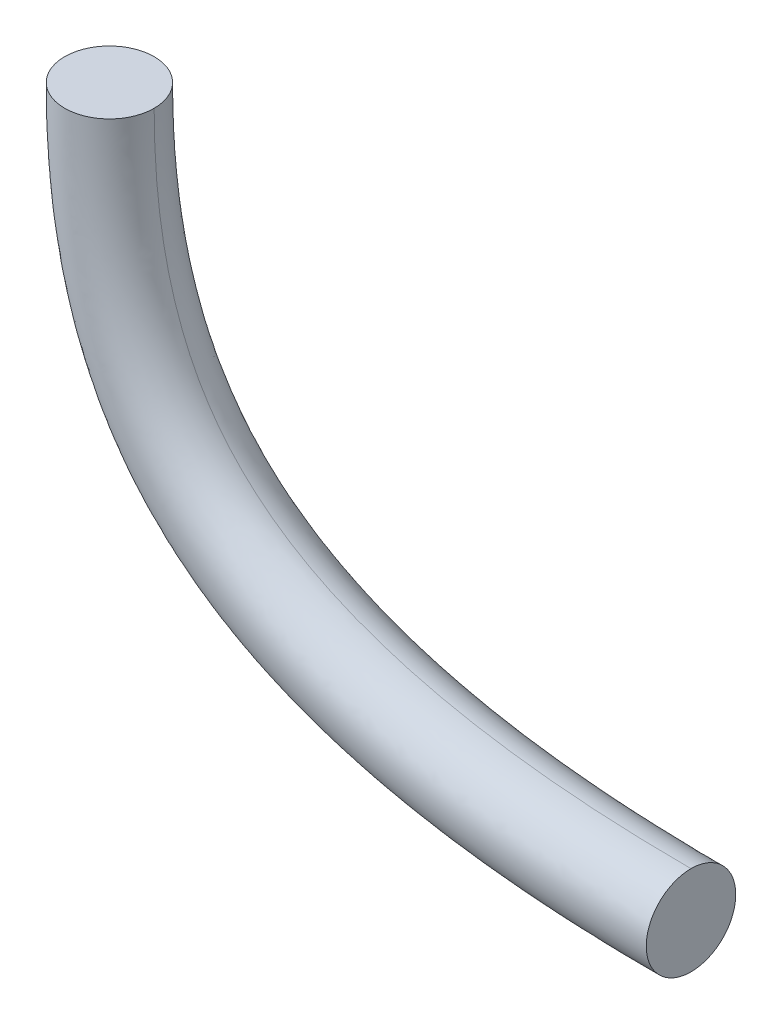
ISO-10303-21;
HEADER;
FILE_DESCRIPTION(('STEP AP214'),'2;1');
FILE_NAME('part.step','',(''),(''),'','','');
FILE_SCHEMA(('AUTOMOTIVE_DESIGN { 1 0 10303 214 1 1 1 1 }'));
ENDSEC;
DATA;
#1=APPLICATION_CONTEXT('core data for automotive mechanical design processes');
#2=APPLICATION_PROTOCOL_DEFINITION('international standard','automotive_design',2000,#1);
#3=PRODUCT_CONTEXT('',#1,'mechanical');
#4=PRODUCT('Part','Part','',(#3));
#5=PRODUCT_RELATED_PRODUCT_CATEGORY('part','',(#4));
#6=PRODUCT_DEFINITION_FORMATION('','',#4);
#7=PRODUCT_DEFINITION_CONTEXT('part definition',#1,'design');
#8=PRODUCT_DEFINITION('design','',#6,#7);
#9=PRODUCT_DEFINITION_SHAPE('','',#8);
#10=(LENGTH_UNIT() NAMED_UNIT(*) SI_UNIT(.MILLI.,.METRE.));
#11=(NAMED_UNIT(*) PLANE_ANGLE_UNIT() SI_UNIT($,.RADIAN.));
#12=(NAMED_UNIT(*) SI_UNIT($,.STERADIAN.) SOLID_ANGLE_UNIT());
#13=UNCERTAINTY_MEASURE_WITH_UNIT(LENGTH_MEASURE(1.E-05),#10,'distance_accuracy_value','');
#14=(GEOMETRIC_REPRESENTATION_CONTEXT(3) GLOBAL_UNCERTAINTY_ASSIGNED_CONTEXT((#13)) GLOBAL_UNIT_ASSIGNED_CONTEXT((#10,
#11,#12)) REPRESENTATION_CONTEXT('',''));
#15=CARTESIAN_POINT('',(0.,0.,0.));
#16=DIRECTION('',(0.,0.,1.));
#17=DIRECTION('',(1.,0.,0.));
#18=AXIS2_PLACEMENT_3D('',#15,#16,#17);
#19=CARTESIAN_POINT('',(-11.,2.,5.5));
#20=DIRECTION('',(1.,0.,0.));
#21=DIRECTION('',(0.,0.,-1.));
#22=AXIS2_PLACEMENT_3D('',#19,#20,#21);
#23=PLANE('',#22);
#24=CARTESIAN_POINT('',(-11.,1.5,5.50000000047467));
#25=CARTESIAN_POINT('',(-11.,1.49997611163594,5.47187159733017));
#26=CARTESIAN_POINT('',(-11.,1.50237219271844,5.4437503249946));
#27=CARTESIAN_POINT('',(-11.,1.51182826652427,5.38832327636678));
#28=CARTESIAN_POINT('',(-11.,1.51888484579792,5.361016918501));
#29=CARTESIAN_POINT('',(-11.,1.53749067930192,5.30796517846619));
#30=CARTESIAN_POINT('',(-11.,1.54904201793691,5.28222052693657));
#31=CARTESIAN_POINT('',(-11.,1.5762990841595,5.23304056135759));
#32=CARTESIAN_POINT('',(-11.,1.59200399558169,5.20960479485917));
#33=CARTESIAN_POINT('',(-11.,1.62711478549402,5.16571566963749));
#34=CARTESIAN_POINT('',(-11.,1.64651841987068,5.14526051570735));
#35=CARTESIAN_POINT('',(-11.,1.68851202082951,5.10786902253602));
#36=CARTESIAN_POINT('',(-11.,1.71110643169979,5.09093767422564));
#37=CARTESIAN_POINT('',(-11.,1.75878176757294,5.06113456911236));
#38=CARTESIAN_POINT('',(-11.,1.78385882090735,5.04825661817199));
#39=CARTESIAN_POINT('',(-11.,1.83586139628351,5.02687188322362));
#40=CARTESIAN_POINT('',(-11.,1.86278993350323,5.01837243040884));
#41=CARTESIAN_POINT('',(-11.,1.91769228379949,5.00601907071486));
#42=CARTESIAN_POINT('',(-11.,1.94566609681218,5.00216516355183));
#43=CARTESIAN_POINT('',(-11.,2.00181651875881,4.99921482539218));
#44=CARTESIAN_POINT('',(-11.,2.02999271217362,5.00011047884485));
#45=CARTESIAN_POINT('',(-11.,2.08583782423317,5.00662053011427));
#46=CARTESIAN_POINT('',(-11.,2.11350591613129,5.01224202345699));
#47=CARTESIAN_POINT('',(-11.,2.16746814800086,5.02804261423192));
#48=CARTESIAN_POINT('',(-11.,2.19376407598446,5.03821560635029));
#49=CARTESIAN_POINT('',(-11.,2.24429409406872,5.06283776563508));
#50=CARTESIAN_POINT('',(-11.,2.26852674010904,5.0772898965418));
#51=CARTESIAN_POINT('',(-11.,2.31422051750209,5.11005665102638));
#52=CARTESIAN_POINT('',(-11.,2.33568178528364,5.12837108435467));
#53=CARTESIAN_POINT('',(-11.,2.37522616019578,5.16834384324538));
#54=CARTESIAN_POINT('',(-11.,2.39330909630998,5.19000233798807));
#55=CARTESIAN_POINT('',(-11.,2.42558091923461,5.23604719162305));
#56=CARTESIAN_POINT('',(-11.,2.43977000834686,5.26043340870594));
#57=CARTESIAN_POINT('',(-11.,2.46386342627468,5.31125990543472));
#58=CARTESIAN_POINT('',(-11.,2.47376434930942,5.33770179816923));
#59=CARTESIAN_POINT('',(-11.,2.48896727952398,5.39183966945039));
#60=CARTESIAN_POINT('',(-11.,2.49427631073339,5.41953366417276));
#61=CARTESIAN_POINT('',(-11.,2.49907939082572,5.46491651856478));
#62=CARTESIAN_POINT('',(-11.,2.50000746944241,5.48246287183833));
#63=CARTESIAN_POINT('',(-11.,2.5,5.5));
#64=B_SPLINE_CURVE_WITH_KNOTS('',3,(#24,#25,#26,#27,#28,#29,#30,#31,#32,#33,#34,#35,#36,#37,#38,
#39,#40,#41,#42,#43,#44,#45,#46,#47,#48,#49,#50,#51,#52,#53,#54,#55,#56,#57,#58,#59,#60,#61,#62,
#63),.UNSPECIFIED.,.F.,.F.,(4,2,2,2,2,2,2,2,2,2,2,2,2,2,2,2,2,2,2,4),(0.,0.0842731266473995,
0.16848459818251,0.252735168669724,0.336969196439848,0.421152278926408,0.505453794405473,
0.589625853237824,0.673938392248186,0.758250926107539,0.842422990094128,0.926721658867329,
1.01090758808817,1.09515196159268,1.17939218635095,1.26363667432551,1.34787678461368,
1.43218367859486,1.51636138252271,1.56897272871681),.UNSPECIFIED.);
#65=CARTESIAN_POINT('',(-11.,1.5,5.50000000047467));
#66=VERTEX_POINT('',#65);
#67=CARTESIAN_POINT('',(-11.,2.5,5.50000000000163));
#68=VERTEX_POINT('',#67);
#69=EDGE_CURVE('E49',#66,#68,#64,.T.);
#70=ORIENTED_EDGE('',*,*,#69,.T.);
#71=CARTESIAN_POINT('',(-11.,2.5,5.50000000000163));
#72=CARTESIAN_POINT('',(-11.,2.50002388833726,5.52812840314616));
#73=CARTESIAN_POINT('',(-11.,2.49762780722797,5.55624967547944));
#74=CARTESIAN_POINT('',(-11.,2.48817173336934,5.61167672409826));
#75=CARTESIAN_POINT('',(-11.,2.48111515406968,5.63898308195731));
#76=CARTESIAN_POINT('',(-11.,2.46250932051515,5.69203482197439));
#77=CARTESIAN_POINT('',(-11.,2.45095798185564,5.71777947349302));
#78=CARTESIAN_POINT('',(-11.,2.4237009155862,5.76695943904602));
#79=CARTESIAN_POINT('',(-11.,2.40799600414168,5.79039520552948));
#80=CARTESIAN_POINT('',(-11.,2.37288521418755,5.83428433071772));
#81=CARTESIAN_POINT('',(-11.,2.3534815797914,5.85473948462938));
#82=CARTESIAN_POINT('',(-11.,2.31148797879695,5.89213097776071));
#83=CARTESIAN_POINT('',(-11.,2.28889356791054,5.90906232604956));
#84=CARTESIAN_POINT('',(-11.,2.241218232009,5.93886543111743));
#85=CARTESIAN_POINT('',(-11.,2.21614117866232,5.9517433820339));
#86=CARTESIAN_POINT('',(-11.,2.16413860326579,5.97312811693273));
#87=CARTESIAN_POINT('',(-11.,2.13721006603798,5.98162756972186));
#88=CARTESIAN_POINT('',(-11.,2.08230771572994,5.99398092936355));
#89=CARTESIAN_POINT('',(-11.,2.05433390271358,5.99783483649992));
#90=CARTESIAN_POINT('',(-11.,1.99818348076415,6.00078517460609));
#91=CARTESIAN_POINT('',(-11.,1.97000728735018,5.99988952112658));
#92=CARTESIAN_POINT('',(-11.,1.91416217529684,5.99337946980396));
#93=CARTESIAN_POINT('',(-11.,1.88649408340407,5.98775797643489));
#94=CARTESIAN_POINT('',(-11.,1.83253185154956,5.97195738560855));
#95=CARTESIAN_POINT('',(-11.,1.80623592357565,5.96178439346513));
#96=CARTESIAN_POINT('',(-11.,1.75570590551483,5.9371622341322));
#97=CARTESIAN_POINT('',(-11.,1.73147325948825,5.92271010320238));
#98=CARTESIAN_POINT('',(-11.,1.68577948212642,5.88994334867427));
#99=CARTESIAN_POINT('',(-11.,1.66431821436234,5.87162891532554));
#100=CARTESIAN_POINT('',(-11.,1.62477383948828,5.83165615639718));
#101=CARTESIAN_POINT('',(-11.,1.60669090339471,5.80999766163726));
#102=CARTESIAN_POINT('',(-11.,1.57441908051394,5.76395280797152));
#103=CARTESIAN_POINT('',(-11.,1.56022999142492,5.7395665908751));
#104=CARTESIAN_POINT('',(-11.,1.53613657354541,5.68874009412317));
#105=CARTESIAN_POINT('',(-11.,1.5262356505358,5.662298201379));
#106=CARTESIAN_POINT('',(-11.,1.51103272037286,5.60816033008318));
#107=CARTESIAN_POINT('',(-11.,1.50572368918984,5.58046633535582));
#108=CARTESIAN_POINT('',(-11.,1.50092060917426,5.53508348127505));
#109=CARTESIAN_POINT('',(-11.,1.49999253057456,5.51753712831938));
#110=CARTESIAN_POINT('',(-11.,1.5,5.50000000047467));
#111=B_SPLINE_CURVE_WITH_KNOTS('',3,(#71,#72,#73,#74,#75,#76,#77,#78,#79,#80,#81,#82,#83,#84,
#85,#86,#87,#88,#89,#90,#91,#92,#93,#94,#95,#96,#97,#98,#99,#100,#101,#102,#103,#104,#105,#106,
#107,#108,#109,#110),.UNSPECIFIED.,.F.,.F.,(4,2,2,2,2,2,2,2,2,2,2,2,2,2,2,2,2,2,2,4),(0.,
0.0842731266473978,0.168484598182509,0.252735168669723,0.336969196439844,0.421152278926405,
0.50545379440547,0.589625853237819,0.67393839224818,0.758250926107534,0.842422990094125,
0.926721658867325,1.01090758808817,1.09515196159273,1.17939218635094,1.26363667432554,
1.34787678461367,1.43218367859571,1.51636138252271,1.56897272776716),.UNSPECIFIED.);
#112=EDGE_CURVE('E46',#68,#66,#111,.T.);
#113=ORIENTED_EDGE('',*,*,#112,.T.);
#114=EDGE_LOOP('',(#70,#113));
#115=FACE_BOUND('',#114,.T.);
#116=ADVANCED_FACE('F17',(#115),#23,.T.);
#117=CARTESIAN_POINT('',(-17.5010669160635,6.86,5.5));
#118=DIRECTION('',(0.,-1.,0.));
#119=DIRECTION('',(0.,0.,-1.));
#120=AXIS2_PLACEMENT_3D('',#117,#118,#119);
#121=PLANE('',#120);
#122=CARTESIAN_POINT('',(-18.0010669160634,6.86,5.50000000009493));
#123=CARTESIAN_POINT('',(-18.0010908043954,6.86,5.52812840323947));
#124=CARTESIAN_POINT('',(-17.9986947232809,6.86,5.5562496755723));
#125=CARTESIAN_POINT('',(-17.9892386494119,6.86,5.61167672418935));
#126=CARTESIAN_POINT('',(-17.9821820701071,6.86,5.6389830820471));
#127=CARTESIAN_POINT('',(-17.9635762365427,6.86,5.6920348220607));
#128=CARTESIAN_POINT('',(-17.9520248978784,6.86,5.71777947357717));
#129=CARTESIAN_POINT('',(-17.9247678315998,6.86,5.76695943912509));
#130=CARTESIAN_POINT('',(-17.9090629201509,6.86,5.79039520560562));
#131=CARTESIAN_POINT('',(-17.8739521301886,6.86,5.83428433078731));
#132=CARTESIAN_POINT('',(-17.8545484957886,6.86,5.85473948469534));
#133=CARTESIAN_POINT('',(-17.8125548947872,6.86,5.89213097781883));
#134=CARTESIAN_POINT('',(-17.7899604838976,6.86,5.90906232610347));
#135=CARTESIAN_POINT('',(-17.7422851479905,6.86,5.93886543116244));
#136=CARTESIAN_POINT('',(-17.7172080946414,6.86,5.95174338207424));
#137=CARTESIAN_POINT('',(-17.6652055192409,6.86,5.97312811696336));
#138=CARTESIAN_POINT('',(-17.6382769820115,6.86,5.98162756974747));
#139=CARTESIAN_POINT('',(-17.5833746317012,6.86,5.99398092937891));
#140=CARTESIAN_POINT('',(-17.5554008186841,6.86,5.99783483651006));
#141=CARTESIAN_POINT('',(-17.4992503967341,6.86,6.00078517460575));
#142=CARTESIAN_POINT('',(-17.4710742033203,6.86,5.99988952112098));
#143=CARTESIAN_POINT('',(-17.4152290912682,6.86,5.99337946978794));
#144=CARTESIAN_POINT('',(-17.3875609993765,6.86,5.9877579764137));
#145=CARTESIAN_POINT('',(-17.3335987675249,6.86,5.97195738557729));
#146=CARTESIAN_POINT('',(-17.3073028395529,6.86,5.96178439342897));
#147=CARTESIAN_POINT('',(-17.2567728214967,6.86,5.93716223408662));
#148=CARTESIAN_POINT('',(-17.2325401754728,6.86,5.92271010315227));
#149=CARTESIAN_POINT('',(-17.1868463981171,6.86,5.88994334861564));
#150=CARTESIAN_POINT('',(-17.1653851303564,6.86,5.8716289152629));
#151=CARTESIAN_POINT('',(-17.1258407554898,6.86,5.83165615632716));
#152=CARTESIAN_POINT('',(-17.1077578194003,6.86,5.80999766156387));
#153=CARTESIAN_POINT('',(-17.0754859965281,6.86,5.76395280789211));
#154=CARTESIAN_POINT('',(-17.0612969074436,6.86,5.73956659079305));
#155=CARTESIAN_POINT('',(-17.0372034895736,6.86,5.68874009403671));
#156=CARTESIAN_POINT('',(-17.027302566569,6.86,5.66229820129078));
#157=CARTESIAN_POINT('',(-17.0120996364161,6.86,5.6081603299922));
#158=CARTESIAN_POINT('',(-17.0067906052383,6.86,5.58046633526381));
#159=CARTESIAN_POINT('',(-17.0019875252177,6.86,5.53508348105549));
#160=CARTESIAN_POINT('',(-17.0010594466212,6.86,5.51753712797182));
#161=CARTESIAN_POINT('',(-17.0010669160634,6.86,5.5));
#162=B_SPLINE_CURVE_WITH_KNOTS('',3,(#122,#123,#124,#125,#126,#127,#128,#129,#130,#131,#132,
#133,#134,#135,#136,#137,#138,#139,#140,#141,#142,#143,#144,#145,#146,#147,#148,#149,#150,#151,
#152,#153,#154,#155,#156,#157,#158,#159,#160,#161),.UNSPECIFIED.,.F.,.F.,(4,2,2,2,2,2,2,2,2,2,2,
2,2,2,2,2,2,2,2,4),(0.,0.0842731266473996,0.168484598182512,0.252735168669728,0.336969196439853,
0.421152278926408,0.505453794405469,0.589625853237817,0.673938392248181,0.758250926107534,
0.842422990094125,0.926721658867328,1.01090758808817,1.09515196159271,1.17939218635095,
1.26363667432553,1.34787678461367,1.43218367859536,1.51636138252271,1.56897272814799),.UNSPECIFIED.);
#163=CARTESIAN_POINT('',(-18.0010669160634,6.86,5.50000000009494));
#164=VERTEX_POINT('',#163);
#165=CARTESIAN_POINT('',(-17.0010669160634,6.86,5.50000000000163));
#166=VERTEX_POINT('',#165);
#167=EDGE_CURVE('E31',#164,#166,#162,.T.);
#168=ORIENTED_EDGE('',*,*,#167,.T.);
#169=CARTESIAN_POINT('',(-17.0010669160634,6.86,5.5));
#170=CARTESIAN_POINT('',(-17.0010430277261,6.86,5.47187159685548));
#171=CARTESIAN_POINT('',(-17.0034391088352,6.86,5.44375032452219));
#172=CARTESIAN_POINT('',(-17.0128951826937,6.86,5.38832327590335));
#173=CARTESIAN_POINT('',(-17.0199517619933,6.86,5.36101691804427));
#174=CARTESIAN_POINT('',(-17.0385575955476,6.86,5.30796517802714));
#175=CARTESIAN_POINT('',(-17.050108934207,6.86,5.28222052650848));
#176=CARTESIAN_POINT('',(-17.0773660004763,6.86,5.23304056095539));
#177=CARTESIAN_POINT('',(-17.0930709119208,6.86,5.20960479447187));
#178=CARTESIAN_POINT('',(-17.1281817018747,6.86,5.16571566928352));
#179=CARTESIAN_POINT('',(-17.1475853362708,6.86,5.1452605153718));
#180=CARTESIAN_POINT('',(-17.1895789372651,6.86,5.10786902224033));
#181=CARTESIAN_POINT('',(-17.2121733481515,6.86,5.0909376739514));
#182=CARTESIAN_POINT('',(-17.2598486840529,6.86,5.06113456888338));
#183=CARTESIAN_POINT('',(-17.2849257373996,6.86,5.04825661796682));
#184=CARTESIAN_POINT('',(-17.336928312796,6.86,5.02687188306781));
#185=CARTESIAN_POINT('',(-17.3638568500238,6.86,5.0183724302786));
#186=CARTESIAN_POINT('',(-17.4187592003318,6.86,5.00601907063673));
#187=CARTESIAN_POINT('',(-17.4467330133482,6.86,5.00216516350026));
#188=CARTESIAN_POINT('',(-17.5028834352976,6.86,4.9992148253939));
#189=CARTESIAN_POINT('',(-17.5310596287116,6.86,5.00011047887332));
#190=CARTESIAN_POINT('',(-17.5869047407649,6.86,5.00662053019576));
#191=CARTESIAN_POINT('',(-17.6145728326577,6.86,5.01224202356473));
#192=CARTESIAN_POINT('',(-17.6685350645123,6.86,5.02804261439089));
#193=CARTESIAN_POINT('',(-17.6948309924862,6.86,5.03821560653422));
#194=CARTESIAN_POINT('',(-17.7453610105471,6.86,5.06283776586698));
#195=CARTESIAN_POINT('',(-17.7695936565737,6.86,5.07728989679671));
#196=CARTESIAN_POINT('',(-17.8152874339357,6.86,5.11005665132467));
#197=CARTESIAN_POINT('',(-17.8367487016998,6.86,5.12837108467333));
#198=CARTESIAN_POINT('',(-17.876293076574,6.86,5.16834384360157));
#199=CARTESIAN_POINT('',(-17.8943760126676,6.86,5.19000233836142));
#200=CARTESIAN_POINT('',(-17.9266478355486,6.86,5.23604719202705));
#201=CARTESIAN_POINT('',(-17.9408369246377,6.86,5.26043340912341));
#202=CARTESIAN_POINT('',(-17.9649303425173,6.86,5.31125990587513));
#203=CARTESIAN_POINT('',(-17.974831265527,6.86,5.33770179861914));
#204=CARTESIAN_POINT('',(-17.9900341956901,6.86,5.3918396699148));
#205=CARTESIAN_POINT('',(-17.9953432268732,6.86,5.41953366464218));
#206=CARTESIAN_POINT('',(-18.0001463069091,6.86,5.46491651891267));
#207=CARTESIAN_POINT('',(-18.001074385509,6.86,5.48246287205982));
#208=CARTESIAN_POINT('',(-18.0010669160634,6.86,5.50000000009494));
#209=B_SPLINE_CURVE_WITH_KNOTS('',3,(#169,#170,#171,#172,#173,#174,#175,#176,#177,#178,#179,
#180,#181,#182,#183,#184,#185,#186,#187,#188,#189,#190,#191,#192,#193,#194,#195,#196,#197,#198,
#199,#200,#201,#202,#203,#204,#205,#206,#207,#208),.UNSPECIFIED.,.F.,.F.,(4,2,2,2,2,2,2,2,2,2,2,
2,2,2,2,2,2,2,2,4),(0.,0.0842731266473919,0.168484598182495,0.252735168669698,0.336969196439811,
0.421152278926369,0.505453794405434,0.589625853237787,0.673938392248147,0.7582509261075,
0.84242299009409,0.92672165886729,1.01090758808813,1.09515196159267,1.17939218635091,
1.26363667432549,1.34787678461363,1.43218367859516,1.51636138252267,1.56897272833761),.UNSPECIFIED.);
#210=EDGE_CURVE('E38',#166,#164,#209,.T.);
#211=ORIENTED_EDGE('',*,*,#210,.T.);
#212=EDGE_LOOP('',(#168,#211));
#213=FACE_BOUND('',#212,.T.);
#214=ADVANCED_FACE('F111',(#213),#121,.F.);
#215=CARTESIAN_POINT('',(-17.9983044851242,6.86,5.5524861878453));
#216=CARTESIAN_POINT('',(-18.0001756504663,6.86,5.5347593582888));
#217=CARTESIAN_POINT('',(-18.0010669160634,6.86,5.5172413793103));
#218=CARTESIAN_POINT('',(-18.0010669160634,6.86,5.5));
#219=CARTESIAN_POINT('',(-18.0010669160634,6.86,4.5));
#220=CARTESIAN_POINT('',(-17.0010669160634,6.86,4.5));
#221=CARTESIAN_POINT('',(-17.0010669160634,6.86,5.5));
#222=CARTESIAN_POINT('',(-17.0010669160634,6.86,5.5172413793103));
#223=CARTESIAN_POINT('',(-17.0019581816606,6.86,5.5347593582888));
#224=CARTESIAN_POINT('',(-17.0038293470027,6.86,5.5524861878453));
#225=CARTESIAN_POINT('',(-17.9983044922869,6.0937825595121,5.5524861878415));
#226=CARTESIAN_POINT('',(-18.0001756576343,6.0936450020738,5.534759358285));
#227=CARTESIAN_POINT('',(-18.001066923234,6.0935794812941,5.5172413793066));
#228=CARTESIAN_POINT('',(-18.001066923234,6.0935794812941,5.4999999999962));
#229=CARTESIAN_POINT('',(-18.001066923234,6.0935794812941,4.4999999999962));
#230=CARTESIAN_POINT('',(-17.001066920367,6.1670937962144,4.4999999999962));
#231=CARTESIAN_POINT('',(-17.001066920367,6.1670937962144,5.4999999999962));
#232=CARTESIAN_POINT('',(-17.001066920367,6.1670937962144,5.5172413793066));
#233=CARTESIAN_POINT('',(-17.0019581859668,6.1670282754346,5.534759358285));
#234=CARTESIAN_POINT('',(-17.0038293513142,6.1668907179964,5.5524861878415));
#235=CARTESIAN_POINT('',(-17.9151026979774,5.3712228803783,5.552486187845));
#236=CARTESIAN_POINT('',(-17.9169635495978,5.3708821971717,5.5347593582885));
#237=CARTESIAN_POINT('',(-17.9178499026065,5.3707199243812,5.5172413793101));
#238=CARTESIAN_POINT('',(-17.9178499026065,5.3707199243812,5.4999999999997));
#239=CARTESIAN_POINT('',(-17.9178499026064,5.3707199243812,4.4999999999997));
#240=CARTESIAN_POINT('',(-16.9233618268845,5.5527899953199,4.4999999999997));
#241=CARTESIAN_POINT('',(-16.9233618268845,5.5527899953199,5.4999999999997));
#242=CARTESIAN_POINT('',(-16.9233618268845,5.5527899953199,5.5172413793101));
#243=CARTESIAN_POINT('',(-16.9242481798932,5.5526277225294,5.5347593582885));
#244=CARTESIAN_POINT('',(-16.9261090315136,5.5522870393228,5.552486187845));
#245=CARTESIAN_POINT('',(-17.4629874579664,4.0462539942495,5.5524861878456));
#246=CARTESIAN_POINT('',(-17.4646684163786,4.0453861160624,5.5347593582891));
#247=CARTESIAN_POINT('',(-17.4654690834118,4.0449727319785,5.5172413793106));
#248=CARTESIAN_POINT('',(-17.4654690834118,4.0449727319785,5.5000000000003));
#249=CARTESIAN_POINT('',(-17.4654690834118,4.0449727319785,4.5000000000003));
#250=CARTESIAN_POINT('',(-16.5671206721618,4.5087896740596,4.5000000000003));
#251=CARTESIAN_POINT('',(-16.5671206721618,4.5087896740596,5.5000000000003));
#252=CARTESIAN_POINT('',(-16.5671206721618,4.5087896740596,5.5172413793106));
#253=CARTESIAN_POINT('',(-16.567921339195,4.5083762899758,5.5347593582891));
#254=CARTESIAN_POINT('',(-16.5696022976072,4.5075084117887,5.5524861878456));
#255=CARTESIAN_POINT('',(-17.0874574905929,3.4453937811286,5.5524861878453));
#256=CARTESIAN_POINT('',(-17.0889439706989,3.4442076628,5.5347593582888));
#257=CARTESIAN_POINT('',(-17.089652004644,3.4436426959118,5.5172413793103));
#258=CARTESIAN_POINT('',(-17.089652004644,3.4436426959118,5.5));
#259=CARTESIAN_POINT('',(-17.089652004644,3.4436426959118,4.5));
#260=CARTESIAN_POINT('',(-16.2952379181372,4.0775355443908,4.5));
#261=CARTESIAN_POINT('',(-16.2952379181373,4.0775355443908,5.5));
#262=CARTESIAN_POINT('',(-16.2952379181373,4.0775355443908,5.5172413793103));
#263=CARTESIAN_POINT('',(-16.2959459520824,4.0769705775027,5.5347593582888));
#264=CARTESIAN_POINT('',(-16.2974324321884,4.075784459174,5.5524861878453));
#265=CARTESIAN_POINT('',(-15.4232794328087,1.9921314948412,5.5524861878453));
#266=CARTESIAN_POINT('',(-15.423998820054,1.9902755039866,5.5347593582888));
#267=CARTESIAN_POINT('',(-15.4243414755576,1.9893914662374,5.5172413793103));
#268=CARTESIAN_POINT('',(-15.4243414755576,1.9893914662374,5.5));
#269=CARTESIAN_POINT('',(-15.4243414755576,1.9893914662374,4.5));
#270=CARTESIAN_POINT('',(-15.039882000472,2.9812818208097,4.5));
#271=CARTESIAN_POINT('',(-15.039882000472,2.9812818208097,5.5));
#272=CARTESIAN_POINT('',(-15.039882000472,2.9812818208097,5.5172413793103));
#273=CARTESIAN_POINT('',(-15.0402246559756,2.9803977830605,5.5347593582888));
#274=CARTESIAN_POINT('',(-15.0409440432209,2.9785417922059,5.5524861878453));
#275=CARTESIAN_POINT('',(-13.668561406234,1.502762431783,5.5524861878589));
#276=CARTESIAN_POINT('',(-13.6687936525158,1.5008912664391,5.5347593583023));
#277=CARTESIAN_POINT('',(-13.6689042750869,1.5000000008411,5.5172413793239));
#278=CARTESIAN_POINT('',(-13.6689042750869,1.5000000008411,5.5000000000136));
#279=CARTESIAN_POINT('',(-13.6689042750869,1.5000000008411,4.5000000000136));
#280=CARTESIAN_POINT('',(-13.5447857503523,2.5000000017953,4.5000000000136));
#281=CARTESIAN_POINT('',(-13.5447857503523,2.5000000017953,5.5000000000136));
#282=CARTESIAN_POINT('',(-13.5447857503523,2.5000000017953,5.5172413793239));
#283=CARTESIAN_POINT('',(-13.5448963729233,2.4991087361973,5.5347593583023));
#284=CARTESIAN_POINT('',(-13.5451286192051,2.4972375708534,5.5524861878589));
#285=CARTESIAN_POINT('',(-11.,1.5027624309392,5.5524861878453));
#286=CARTESIAN_POINT('',(-11.,1.5008912655971,5.5347593582888));
#287=CARTESIAN_POINT('',(-11.,1.5,5.5172413793103));
#288=CARTESIAN_POINT('',(-11.,1.5,5.5));
#289=CARTESIAN_POINT('',(-11.,1.5,4.5));
#290=CARTESIAN_POINT('',(-11.,2.5,4.5));
#291=CARTESIAN_POINT('',(-11.,2.5,5.5));
#292=CARTESIAN_POINT('',(-11.,2.5,5.5172413793103));
#293=CARTESIAN_POINT('',(-11.,2.4991087344029,5.5347593582888));
#294=CARTESIAN_POINT('',(-11.,2.4972375690608,5.5524861878453));
#295=(BOUNDED_SURFACE() B_SPLINE_SURFACE(3,3,((#215,#216,#217,#218,#219,#220,#221,#222,#223,
#224),(#225,#226,#227,#228,#229,#230,#231,#232,#233,#234),(#235,#236,#237,#238,#239,#240,#241,
#242,#243,#244),(#245,#246,#247,#248,#249,#250,#251,#252,#253,#254),(#255,#256,#257,#258,#259,
#260,#261,#262,#263,#264),(#265,#266,#267,#268,#269,#270,#271,#272,#273,#274),(#275,#276,#277,
#278,#279,#280,#281,#282,#283,#284),(#285,#286,#287,#288,#289,#290,#291,#292,#293,#294)),
.UNSPECIFIED.,.F.,.F.,.F.) B_SPLINE_SURFACE_WITH_KNOTS((4,2,2,4),(4,3,3,4),(0.,0.25,0.5,1.),
(0.475,0.5,1.,1.025),
.UNSPECIFIED.) GEOMETRIC_REPRESENTATION_ITEM() RATIONAL_B_SPLINE_SURFACE(((0.905,0.935,
0.966666666666667,1.,0.333333333333333,0.333333333333333,1.,0.966666666666667,0.935,0.905),
(0.905,0.935,0.966666666666667,1.,0.333333333333333,0.333333333333333,1.,0.966666666666667,
0.935,0.905),(0.905,0.935,0.966666666666667,1.,0.333333333333333,0.333333333333333,1.,
0.966666666666667,0.935,0.905),(0.905,0.935,0.966666666666667,1.,0.333333333333333,
0.333333333333333,1.,0.966666666666667,0.935,0.905),(0.905,0.935,0.966666666666667,1.,
0.333333333333333,0.333333333333333,1.,0.966666666666667,0.935,0.905),(0.905,0.935,
0.966666666666667,1.,0.333333333333333,0.333333333333333,1.,0.966666666666667,0.935,0.905),
(0.905,0.935,0.966666666666667,1.,0.333333333333333,0.333333333333333,1.,0.966666666666667,
0.935,0.905),(0.905,0.935,0.966666666666667,1.,0.333333333333333,0.333333333333333,1.,
0.966666666666667,0.935,0.905))) REPRESENTATION_ITEM('') SURFACE());
#296=CARTESIAN_POINT('',(-17.0010669160634,6.86,5.5));
#297=CARTESIAN_POINT('',(-17.001066920367,6.1670937962144,5.4999999999962));
#298=CARTESIAN_POINT('',(-16.9233618268845,5.5527899953199,5.4999999999997));
#299=CARTESIAN_POINT('',(-16.5671206721618,4.5087896740596,5.5000000000003));
#300=CARTESIAN_POINT('',(-16.2952379181373,4.0775355443908,5.5));
#301=CARTESIAN_POINT('',(-15.039882000472,2.9812818208097,5.5));
#302=CARTESIAN_POINT('',(-13.5447857503523,2.5000000017953,5.5000000000136));
#303=CARTESIAN_POINT('',(-11.,2.5,5.5));
#304=(BOUNDED_CURVE() B_SPLINE_CURVE(3,(#296,#297,#298,#299,#300,#301,#302,#303),.UNSPECIFIED.,
.F.,.F.) B_SPLINE_CURVE_WITH_KNOTS((4,2,2,4),(0.,0.25,0.5,1.),
.UNSPECIFIED.) CURVE() GEOMETRIC_REPRESENTATION_ITEM() RATIONAL_B_SPLINE_CURVE((1.,1.,1.,1.,1.,
1.,1.,1.)) REPRESENTATION_ITEM(''));
#305=EDGE_CURVE('E11',#166,#68,#304,.T.);
#306=CARTESIAN_POINT('',(-11.,1.5,5.5));
#307=CARTESIAN_POINT('',(-13.6689042750869,1.5000000008411,5.5000000000136));
#308=CARTESIAN_POINT('',(-15.4243414755576,1.9893914662374,5.5));
#309=CARTESIAN_POINT('',(-17.089652004644,3.4436426959118,5.5));
#310=CARTESIAN_POINT('',(-17.4654690834118,4.0449727319785,5.5000000000003));
#311=CARTESIAN_POINT('',(-17.9178499026065,5.3707199243812,5.4999999999997));
#312=CARTESIAN_POINT('',(-18.001066923234,6.0935794812941,5.4999999999962));
#313=CARTESIAN_POINT('',(-18.0010669160634,6.86,5.5));
#314=(BOUNDED_CURVE() B_SPLINE_CURVE(3,(#306,#307,#308,#309,#310,#311,#312,#313),.UNSPECIFIED.,
.F.,.F.) B_SPLINE_CURVE_WITH_KNOTS((4,2,2,4),(0.,0.5,0.75,1.),
.UNSPECIFIED.) CURVE() GEOMETRIC_REPRESENTATION_ITEM() RATIONAL_B_SPLINE_CURVE((0.999999999999999,
0.999999999999999,0.999999999999999,0.999999999999999,0.999999999999999,0.999999999999999,
0.999999999999999,0.999999999999999)) REPRESENTATION_ITEM(''));
#315=EDGE_CURVE('E51',#66,#164,#314,.T.);
#316=ORIENTED_EDGE('',*,*,#305,.T.);
#317=ORIENTED_EDGE('',*,*,#69,.F.);
#318=ORIENTED_EDGE('',*,*,#315,.T.);
#319=ORIENTED_EDGE('',*,*,#210,.F.);
#320=EDGE_LOOP('',(#316,#317,#318,#319));
#321=FACE_BOUND('',#320,.T.);
#322=ADVANCED_FACE('F50',(#321),#295,.F.);
#323=CARTESIAN_POINT('',(-17.0165884150732,7.6928567078426,5.3266383810063));
#324=CARTESIAN_POINT('',(-17.0123353906584,7.6924815180298,5.3669301913906));
#325=CARTESIAN_POINT('',(-17.0080823662436,7.6921063282171,5.4072220017749));
#326=CARTESIAN_POINT('',(-17.0038293418288,7.6917311384044,5.4475138121592));
#327=CARTESIAN_POINT('',(-17.0019581764932,7.6915660694785,5.4652406417158));
#328=CARTESIAN_POINT('',(-17.0010669108991,7.6914874445428,5.4827586206942));
#329=CARTESIAN_POINT('',(-17.0010669108991,7.6914874445428,5.5000000000045));
#330=CARTESIAN_POINT('',(-17.0010669108991,7.6914874445427,6.5000000000046));
#331=CARTESIAN_POINT('',(-18.0010669074588,7.7797046224471,6.5000000000046));
#332=CARTESIAN_POINT('',(-18.0010669074588,7.7797046224471,5.5000000000045));
#333=CARTESIAN_POINT('',(-18.0010669074588,7.7797046224471,5.4827586206942));
#334=CARTESIAN_POINT('',(-18.0001756418647,7.7796259975114,5.4652406417158));
#335=CARTESIAN_POINT('',(-17.9983044765291,7.7794609285855,5.4475138121592));
#336=CARTESIAN_POINT('',(-17.9940514521143,7.7790857387728,5.4072220017749));
#337=CARTESIAN_POINT('',(-17.9897984276995,7.77871054896,5.3669301913906));
#338=CARTESIAN_POINT('',(-17.9855454032847,7.7783353591473,5.3266383810064));
#339=CARTESIAN_POINT('',(-17.0165884168125,7.4152378052284,5.3266383810048));
#340=CARTESIAN_POINT('',(-17.0123353923928,7.4149876786866,5.3669301913891));
#341=CARTESIAN_POINT('',(-17.0080823679731,7.4147375521447,5.4072220017734));
#342=CARTESIAN_POINT('',(-17.0038293435535,7.4144874256029,5.4475138121577));
#343=CARTESIAN_POINT('',(-17.0019581782157,7.4143773796523,5.4652406417143));
#344=CARTESIAN_POINT('',(-17.0010669126206,7.4143249630285,5.4827586206927));
#345=CARTESIAN_POINT('',(-17.0010669126206,7.4143249630285,5.500000000003));
#346=CARTESIAN_POINT('',(-17.0010669126206,7.4143249630285,6.500000000003));
#347=CARTESIAN_POINT('',(-18.001066910327,7.4731364149647,6.500000000003));
#348=CARTESIAN_POINT('',(-18.001066910327,7.4731364149648,5.500000000003));
#349=CARTESIAN_POINT('',(-18.001066910327,7.4731364149648,5.4827586206927));
#350=CARTESIAN_POINT('',(-18.0001756447319,7.4730839983409,5.4652406417143));
#351=CARTESIAN_POINT('',(-17.9983044793941,7.4729739523903,5.4475138121577));
#352=CARTESIAN_POINT('',(-17.9940514549744,7.4727238258485,5.4072220017734));
#353=CARTESIAN_POINT('',(-17.9897984305548,7.4724736993067,5.3669301913891));
#354=CARTESIAN_POINT('',(-17.9855454061351,7.4722235727649,5.3266383810048));
#355=CARTESIAN_POINT('',(-17.0165884185518,7.1376189026142,5.3266383810033));
#356=CARTESIAN_POINT('',(-17.0123353941272,7.1374938393433,5.3669301913876));
#357=CARTESIAN_POINT('',(-17.0080823697026,7.1373687760724,5.4072220017719));
#358=CARTESIAN_POINT('',(-17.0038293452781,7.1372437128015,5.4475138121562));
#359=CARTESIAN_POINT('',(-17.0019581799381,7.1371886898262,5.4652406417127));
#360=CARTESIAN_POINT('',(-17.001066914342,7.1371624815143,5.4827586206912));
#361=CARTESIAN_POINT('',(-17.001066914342,7.1371624815143,5.5000000000015));
#362=CARTESIAN_POINT('',(-17.001066914342,7.1371624815142,6.5000000000015));
#363=CARTESIAN_POINT('',(-18.0010669131952,7.1665682074824,6.5000000000015));
#364=CARTESIAN_POINT('',(-18.0010669131952,7.1665682074824,5.5000000000015));
#365=CARTESIAN_POINT('',(-18.0010669131952,7.1665682074824,5.4827586206912));
#366=CARTESIAN_POINT('',(-18.0001756475991,7.1665419991705,5.4652406417127));
#367=CARTESIAN_POINT('',(-17.9983044822592,7.1664869761952,5.4475138121562));
#368=CARTESIAN_POINT('',(-17.9940514578346,7.1663619129243,5.4072220017719));
#369=CARTESIAN_POINT('',(-17.98979843341,7.1662368496533,5.3669301913876));
#370=CARTESIAN_POINT('',(-17.9855454089855,7.1661117863824,5.3266383810033));
#371=CARTESIAN_POINT('',(-17.016588420291,6.86,5.3266383810018));
#372=CARTESIAN_POINT('',(-17.0123353958616,6.86,5.3669301913861));
#373=CARTESIAN_POINT('',(-17.0080823714321,6.86,5.4072220017704));
#374=CARTESIAN_POINT('',(-17.0038293470027,6.86,5.4475138121547));
#375=CARTESIAN_POINT('',(-17.0019581816606,6.86,5.4652406417112));
#376=CARTESIAN_POINT('',(-17.0010669160634,6.86,5.4827586206897));
#377=CARTESIAN_POINT('',(-17.0010669160634,6.86,5.5));
#378=CARTESIAN_POINT('',(-17.0010669160634,6.86,6.5));
#379=CARTESIAN_POINT('',(-18.0010669160634,6.86,6.5));
#380=CARTESIAN_POINT('',(-18.0010669160634,6.86,5.5));
#381=CARTESIAN_POINT('',(-18.0010669160634,6.86,5.4827586206897));
#382=CARTESIAN_POINT('',(-18.0001756504663,6.86,5.4652406417112));
#383=CARTESIAN_POINT('',(-17.9983044851242,6.86,5.4475138121547));
#384=CARTESIAN_POINT('',(-17.9940514606948,6.86,5.4072220017704));
#385=CARTESIAN_POINT('',(-17.9897984362653,6.86,5.3669301913861));
#386=CARTESIAN_POINT('',(-17.9855454118359,6.86,5.3266383810018));
#387=CARTESIAN_POINT('',(-17.0165884246391,6.1659527434645,5.326638380998));
#388=CARTESIAN_POINT('',(-17.0123354001975,6.1662654016418,5.3669301913823));
#389=CARTESIAN_POINT('',(-17.0080823757558,6.1665780598191,5.4072220017666));
#390=CARTESIAN_POINT('',(-17.0038293513142,6.1668907179964,5.4475138121509));
#391=CARTESIAN_POINT('',(-17.0019581859667,6.1670282754346,5.4652406417074));
#392=CARTESIAN_POINT('',(-17.001066920367,6.1670937962144,5.4827586206859));
#393=CARTESIAN_POINT('',(-17.001066920367,6.1670937962144,5.4999999999962));
#394=CARTESIAN_POINT('',(-17.001066920367,6.1670937962144,6.4999999999962));
#395=CARTESIAN_POINT('',(-18.001066923234,6.0935794812941,6.4999999999962));
#396=CARTESIAN_POINT('',(-18.001066923234,6.0935794812941,5.4999999999962));
#397=CARTESIAN_POINT('',(-18.001066923234,6.0935794812941,5.4827586206859));
#398=CARTESIAN_POINT('',(-18.0001756576343,6.0936450020738,5.4652406417074));
#399=CARTESIAN_POINT('',(-17.9983044922869,6.0937825595121,5.4475138121509));
#400=CARTESIAN_POINT('',(-17.9940514678452,6.0940952176893,5.4072220017666));
#401=CARTESIAN_POINT('',(-17.9897984434036,6.0944078758666,5.3669301913823));
#402=CARTESIAN_POINT('',(-17.9855454189619,6.0947205340439,5.326638380998));
#403=CARTESIAN_POINT('',(-16.9387977777561,5.5499639939441,5.3266383810015));
#404=CARTESIAN_POINT('',(-16.9345681956753,5.5507383424037,5.3669301913858));
#405=CARTESIAN_POINT('',(-16.9303386135944,5.5515126908633,5.4072220017701));
#406=CARTESIAN_POINT('',(-16.9261090315136,5.5522870393228,5.4475138121544));
#407=CARTESIAN_POINT('',(-16.9242481798932,5.5526277225294,5.465240641711));
#408=CARTESIAN_POINT('',(-16.9233618268845,5.5527899953199,5.4827586206894));
#409=CARTESIAN_POINT('',(-16.9233618268845,5.5527899953199,5.4999999999997));
#410=CARTESIAN_POINT('',(-16.9233618268845,5.5527899953199,6.4999999999997));
#411=CARTESIAN_POINT('',(-17.9178499026064,5.3707199243812,6.4999999999997));
#412=CARTESIAN_POINT('',(-17.9178499026065,5.3707199243812,5.4999999999997));
#413=CARTESIAN_POINT('',(-17.9178499026065,5.3707199243812,5.4827586206894));
#414=CARTESIAN_POINT('',(-17.9169635495978,5.3708821971717,5.465240641711));
#415=CARTESIAN_POINT('',(-17.9151026979774,5.3712228803783,5.4475138121544));
#416=CARTESIAN_POINT('',(-17.9108731158965,5.3719972288379,5.4072220017701));
#417=CARTESIAN_POINT('',(-17.9066435338157,5.3727715772974,5.3669301913858));
#418=CARTESIAN_POINT('',(-17.9024139517348,5.373545925757,5.3266383810015));
#419=CARTESIAN_POINT('',(-16.5810643908249,4.5015905374323,5.3266383810021));
#420=CARTESIAN_POINT('',(-16.5772436930857,4.5035631622177,5.3669301913864));
#421=CARTESIAN_POINT('',(-16.5734229953464,4.5055357870032,5.4072220017707));
#422=CARTESIAN_POINT('',(-16.5696022976072,4.5075084117887,5.447513812155));
#423=CARTESIAN_POINT('',(-16.567921339195,4.5083762899758,5.4652406417115));
#424=CARTESIAN_POINT('',(-16.5671206721618,4.5087896740596,5.4827586206899));
#425=CARTESIAN_POINT('',(-16.5671206721618,4.5087896740596,5.5000000000003));
#426=CARTESIAN_POINT('',(-16.5671206721618,4.5087896740596,6.5000000000003));
#427=CARTESIAN_POINT('',(-17.4654690834118,4.0449727319785,6.5000000000003));
#428=CARTESIAN_POINT('',(-17.4654690834118,4.0449727319785,5.5000000000003));
#429=CARTESIAN_POINT('',(-17.4654690834118,4.0449727319785,5.4827586206899));
#430=CARTESIAN_POINT('',(-17.4646684163786,4.0453861160624,5.4652406417115));
#431=CARTESIAN_POINT('',(-17.4629874579664,4.0462539942495,5.447513812155));
#432=CARTESIAN_POINT('',(-17.4591667602271,4.0482266190349,5.4072220017707));
#433=CARTESIAN_POINT('',(-17.4553460624879,4.0501992438204,5.3669301913864));
#434=CARTESIAN_POINT('',(-17.4515253647487,4.0521718686059,5.3266383810021));
#435=CARTESIAN_POINT('',(-16.3075684197394,4.0676965738633,5.3266383810018));
#436=CARTESIAN_POINT('',(-16.3041897572224,4.0703925356335,5.3669301913861));
#437=CARTESIAN_POINT('',(-16.3008110947054,4.0730884974038,5.4072220017704));
#438=CARTESIAN_POINT('',(-16.2974324321884,4.075784459174,5.4475138121547));
#439=CARTESIAN_POINT('',(-16.2959459520824,4.0769705775027,5.4652406417112));
#440=CARTESIAN_POINT('',(-16.2952379181372,4.0775355443908,5.4827586206897));
#441=CARTESIAN_POINT('',(-16.2952379181373,4.0775355443908,5.5));
#442=CARTESIAN_POINT('',(-16.2952379181372,4.0775355443908,6.5));
#443=CARTESIAN_POINT('',(-17.089652004644,3.4436426959118,6.5));
#444=CARTESIAN_POINT('',(-17.089652004644,3.4436426959118,5.5));
#445=CARTESIAN_POINT('',(-17.089652004644,3.4436426959118,5.4827586206897));
#446=CARTESIAN_POINT('',(-17.0889439706989,3.4442076628,5.4652406417112));
#447=CARTESIAN_POINT('',(-17.0874574905929,3.4453937811286,5.4475138121547));
#448=CARTESIAN_POINT('',(-17.0840788280759,3.4480897428989,5.4072220017704));
#449=CARTESIAN_POINT('',(-17.0807001655589,3.4507857046691,5.3669301913861));
#450=CARTESIAN_POINT('',(-17.0773215030419,3.4534816664393,5.3266383810018));
#451=CARTESIAN_POINT('',(-15.0458493898399,2.9658861904779,5.3266383810018));
#452=CARTESIAN_POINT('',(-15.0442142743002,2.9701047243872,5.3669301913861));
#453=CARTESIAN_POINT('',(-15.0425791587605,2.9743232582966,5.4072220017704));
#454=CARTESIAN_POINT('',(-15.0409440432209,2.9785417922059,5.4475138121547));
#455=CARTESIAN_POINT('',(-15.0402246559756,2.9803977830605,5.4652406417112));
#456=CARTESIAN_POINT('',(-15.039882000472,2.9812818208097,5.4827586206897));
#457=CARTESIAN_POINT('',(-15.039882000472,2.9812818208097,5.5));
#458=CARTESIAN_POINT('',(-15.039882000472,2.9812818208097,6.5));
#459=CARTESIAN_POINT('',(-15.4243414755576,1.9893914662374,6.5));
#460=CARTESIAN_POINT('',(-15.4243414755576,1.9893914662374,5.5));
#461=CARTESIAN_POINT('',(-15.4243414755576,1.9893914662374,5.4827586206897));
#462=CARTESIAN_POINT('',(-15.423998820054,1.9902755039866,5.4652406417112));
#463=CARTESIAN_POINT('',(-15.4232794328087,1.9921314948412,5.4475138121547));
#464=CARTESIAN_POINT('',(-15.4216443172691,1.9963500287505,5.4072220017704));
#465=CARTESIAN_POINT('',(-15.4200092017294,2.0005685626599,5.3669301913861));
#466=CARTESIAN_POINT('',(-15.4183740861897,2.0047870965692,5.3266383810018));
#467=CARTESIAN_POINT('',(-13.5467122565587,2.4844784975529,5.3266383810154));
#468=CARTESIAN_POINT('',(-13.5461843774408,2.4887315219864,5.3669301913997));
#469=CARTESIAN_POINT('',(-13.545656498323,2.4929845464199,5.407222001784));
#470=CARTESIAN_POINT('',(-13.5451286192051,2.4972375708534,5.4475138121683));
#471=CARTESIAN_POINT('',(-13.5448963729233,2.4991087361973,5.4652406417248));
#472=CARTESIAN_POINT('',(-13.5447857503523,2.5000000017953,5.4827586207032));
#473=CARTESIAN_POINT('',(-13.5447857503523,2.5000000017953,5.5000000000136));
#474=CARTESIAN_POINT('',(-13.5447857503523,2.5000000017953,6.5000000000136));
#475=CARTESIAN_POINT('',(-13.6689042750869,1.5000000008411,6.5000000000136));
#476=CARTESIAN_POINT('',(-13.6689042750869,1.5000000008411,5.5000000000136));
#477=CARTESIAN_POINT('',(-13.6689042750869,1.5000000008411,5.4827586207032));
#478=CARTESIAN_POINT('',(-13.6687936525158,1.5008912664391,5.4652406417248));
#479=CARTESIAN_POINT('',(-13.668561406234,1.502762431783,5.4475138121683));
#480=CARTESIAN_POINT('',(-13.6680335271162,1.5070154562165,5.407222001784));
#481=CARTESIAN_POINT('',(-13.6675056479983,1.51126848065,5.3669301913997));
#482=CARTESIAN_POINT('',(-13.6669777688805,1.5155215050835,5.3266383810154));
#483=CARTESIAN_POINT('',(-11.,2.4844784957724,5.3266383810018));
#484=CARTESIAN_POINT('',(-11.,2.4887315202019,5.3669301913861));
#485=CARTESIAN_POINT('',(-11.,2.4929845446313,5.4072220017704));
#486=CARTESIAN_POINT('',(-11.,2.4972375690608,5.4475138121547));
#487=CARTESIAN_POINT('',(-11.,2.4991087344029,5.4652406417112));
#488=CARTESIAN_POINT('',(-11.,2.5,5.4827586206897));
#489=CARTESIAN_POINT('',(-11.,2.5,5.5));
#490=CARTESIAN_POINT('',(-11.,2.5,6.5));
#491=CARTESIAN_POINT('',(-11.,1.5,6.5));
#492=CARTESIAN_POINT('',(-11.,1.5,5.5));
#493=CARTESIAN_POINT('',(-11.,1.5,5.4827586206897));
#494=CARTESIAN_POINT('',(-11.,1.5008912655971,5.4652406417112));
#495=CARTESIAN_POINT('',(-11.,1.5027624309392,5.4475138121547));
#496=CARTESIAN_POINT('',(-11.,1.5070154553687,5.4072220017704));
#497=CARTESIAN_POINT('',(-11.,1.5112684797981,5.3669301913861));
#498=CARTESIAN_POINT('',(-11.,1.5155215042276,5.3266383810018));
#499=CARTESIAN_POINT('',(-10.4906575486883,2.4844784954163,5.3266383809991));
#500=CARTESIAN_POINT('',(-10.4907631245118,2.488731519845,5.3669301913834));
#501=CARTESIAN_POINT('',(-10.4908687003354,2.4929845442736,5.4072220017677));
#502=CARTESIAN_POINT('',(-10.490974276159,2.4972375687022,5.447513812152));
#503=CARTESIAN_POINT('',(-10.4910207254153,2.499108734044,5.4652406417085));
#504=CARTESIAN_POINT('',(-10.4910428499295,2.4999999996409,5.4827586206869));
#505=CARTESIAN_POINT('',(-10.4910428499295,2.4999999996409,5.4999999999973));
#506=CARTESIAN_POINT('',(-10.4910428499295,2.4999999996409,6.4999999999973));
#507=CARTESIAN_POINT('',(-10.4662191449826,1.4999999998318,6.4999999999973));
#508=CARTESIAN_POINT('',(-10.4662191449826,1.4999999998318,5.4999999999973));
#509=CARTESIAN_POINT('',(-10.4662191449826,1.4999999998318,5.4827586206869));
#510=CARTESIAN_POINT('',(-10.4662412694968,1.5008912654288,5.4652406417085));
#511=CARTESIAN_POINT('',(-10.4662877187532,1.5027624307705,5.447513812152));
#512=CARTESIAN_POINT('',(-10.4663932945768,1.5070154551991,5.4072220017677));
#513=CARTESIAN_POINT('',(-10.4664988704003,1.5112684796278,5.3669301913834));
#514=CARTESIAN_POINT('',(-10.4666044462239,1.5155215040564,5.3266383809991));
#515=CARTESIAN_POINT('',(-9.9813150973765,2.4844784950602,5.3266383809964));
#516=CARTESIAN_POINT('',(-9.9815262490237,2.488731519488,5.3669301913807));
#517=CARTESIAN_POINT('',(-9.9817374006708,2.4929845439159,5.407222001765));
#518=CARTESIAN_POINT('',(-9.9819485523179,2.4972375683437,5.4475138121493));
#519=CARTESIAN_POINT('',(-9.9820414508307,2.4991087336851,5.4652406417058));
#520=CARTESIAN_POINT('',(-9.9820856998591,2.4999999992819,5.4827586206842));
#521=CARTESIAN_POINT('',(-9.9820856998591,2.4999999992819,5.4999999999946));
#522=CARTESIAN_POINT('',(-9.9820856998591,2.4999999992819,6.4999999999946));
#523=CARTESIAN_POINT('',(-9.9324382899653,1.4999999996636,6.4999999999946));
#524=CARTESIAN_POINT('',(-9.9324382899652,1.4999999996636,5.4999999999946));
#525=CARTESIAN_POINT('',(-9.9324382899652,1.4999999996636,5.4827586206842));
#526=CARTESIAN_POINT('',(-9.9324825389937,1.5008912652604,5.4652406417058));
#527=CARTESIAN_POINT('',(-9.9325754375064,1.5027624306017,5.4475138121493));
#528=CARTESIAN_POINT('',(-9.9327865891535,1.5070154550296,5.407222001765));
#529=CARTESIAN_POINT('',(-9.9329977408007,1.5112684794574,5.3669301913807));
#530=CARTESIAN_POINT('',(-9.9332088924478,1.5155215038852,5.3266383809964));
#531=CARTESIAN_POINT('',(-9.4719726460648,2.4844784947041,5.3266383809936));
#532=CARTESIAN_POINT('',(-9.4722893735355,2.4887315191311,5.3669301913779));
#533=CARTESIAN_POINT('',(-9.4726061010062,2.4929845435582,5.4072220017622));
#534=CARTESIAN_POINT('',(-9.4729228284769,2.4972375679852,5.4475138121465));
#535=CARTESIAN_POINT('',(-9.473062176246,2.4991087333262,5.4652406417031));
#536=CARTESIAN_POINT('',(-9.4731285497886,2.4999999989228,5.4827586206815));
#537=CARTESIAN_POINT('',(-9.4731285497886,2.4999999989228,5.4999999999919));
#538=CARTESIAN_POINT('',(-9.4731285497886,2.4999999989228,6.4999999999919));
#539=CARTESIAN_POINT('',(-9.3986574349479,1.4999999994953,6.4999999999919));
#540=CARTESIAN_POINT('',(-9.3986574349479,1.4999999994953,5.4999999999919));
#541=CARTESIAN_POINT('',(-9.3986574349479,1.4999999994953,5.4827586206815));
#542=CARTESIAN_POINT('',(-9.3987238084905,1.500891265092,5.4652406417031));
#543=CARTESIAN_POINT('',(-9.3988631562596,1.502762430433,5.4475138121465));
#544=CARTESIAN_POINT('',(-9.3991798837303,1.50701545486,5.4072220017623));
#545=CARTESIAN_POINT('',(-9.399496611201,1.511268479287,5.366930191378));
#546=CARTESIAN_POINT('',(-9.3998133386717,1.515521503714,5.3266383809937));
#547=(BOUNDED_SURFACE() B_SPLINE_SURFACE(3,3,((#323,#324,#325,#326,#327,#328,#329,#330,#331,
#332,#333,#334,#335,#336,#337,#338),(#339,#340,#341,#342,#343,#344,#345,#346,#347,#348,#349,
#350,#351,#352,#353,#354),(#355,#356,#357,#358,#359,#360,#361,#362,#363,#364,#365,#366,#367,
#368,#369,#370),(#371,#372,#373,#374,#375,#376,#377,#378,#379,#380,#381,#382,#383,#384,#385,
#386),(#387,#388,#389,#390,#391,#392,#393,#394,#395,#396,#397,#398,#399,#400,#401,#402),(#403,
#404,#405,#406,#407,#408,#409,#410,#411,#412,#413,#414,#415,#416,#417,#418),(#419,#420,#421,
#422,#423,#424,#425,#426,#427,#428,#429,#430,#431,#432,#433,#434),(#435,#436,#437,#438,#439,
#440,#441,#442,#443,#444,#445,#446,#447,#448,#449,#450),(#451,#452,#453,#454,#455,#456,#457,
#458,#459,#460,#461,#462,#463,#464,#465,#466),(#467,#468,#469,#470,#471,#472,#473,#474,#475,
#476,#477,#478,#479,#480,#481,#482),(#483,#484,#485,#486,#487,#488,#489,#490,#491,#492,#493,
#494,#495,#496,#497,#498),(#499,#500,#501,#502,#503,#504,#505,#506,#507,#508,#509,#510,#511,
#512,#513,#514),(#515,#516,#517,#518,#519,#520,#521,#522,#523,#524,#525,#526,#527,#528,#529,
#530),(#531,#532,#533,#534,#535,#536,#537,#538,#539,#540,#541,#542,#543,#544,#545,#546)),
.UNSPECIFIED.,.F.,.F.,.F.) B_SPLINE_SURFACE_WITH_KNOTS((4,3,2,2,3,4),(4,3,3,3,3,4),(-0.1,0.,
0.25,0.5,1.,1.1),(0.92,0.975,1.,1.5,1.525,1.58),
.UNSPECIFIED.) GEOMETRIC_REPRESENTATION_ITEM() RATIONAL_B_SPLINE_SURFACE(((0.905,0.905,0.905,
0.905,0.935,0.966666666666667,1.,0.333333333333333,0.333333333333333,1.,0.966666666666667,0.935,
0.905,0.905,0.905,0.905),(0.905,0.905,0.905,0.905,0.935,0.966666666666667,1.,0.333333333333333,
0.333333333333333,1.,0.966666666666667,0.935,0.905,0.905,0.905,0.905),(0.905,0.905,0.905,0.905,
0.935,0.966666666666667,1.,0.333333333333333,0.333333333333333,1.,0.966666666666667,0.935,0.905,
0.905,0.905,0.905),(0.905,0.905,0.905,0.905,0.935,0.966666666666667,1.,0.333333333333333,
0.333333333333333,1.,0.966666666666667,0.935,0.905,0.905,0.905,0.905),(0.905,0.905,0.905,0.905,
0.935,0.966666666666667,1.,0.333333333333333,0.333333333333333,1.,0.966666666666667,0.935,0.905,
0.905,0.905,0.905),(0.905,0.905,0.905,0.905,0.935,0.966666666666667,1.,0.333333333333333,
0.333333333333333,1.,0.966666666666667,0.935,0.905,0.905,0.905,0.905),(0.905,0.905,0.905,0.905,
0.935,0.966666666666667,1.,0.333333333333333,0.333333333333333,1.,0.966666666666667,0.935,0.905,
0.905,0.905,0.905),(0.905,0.905,0.905,0.905,0.935,0.966666666666667,1.,0.333333333333333,
0.333333333333333,1.,0.966666666666667,0.935,0.905,0.905,0.905,0.905),(0.905,0.905,0.905,0.905,
0.935,0.966666666666667,1.,0.333333333333333,0.333333333333333,1.,0.966666666666667,0.935,0.905,
0.905,0.905,0.905),(0.905,0.905,0.905,0.905,0.935,0.966666666666667,1.,0.333333333333333,
0.333333333333333,1.,0.966666666666667,0.935,0.905,0.905,0.905,0.905),(0.905,0.905,0.905,0.905,
0.935,0.966666666666667,1.,0.333333333333333,0.333333333333333,1.,0.966666666666667,0.935,0.905,
0.905,0.905,0.905),(0.905,0.905,0.905,0.905,0.935,0.966666666666667,1.,0.333333333333333,
0.333333333333333,1.,0.966666666666667,0.935,0.905,0.905,0.905,0.905),(0.905,0.905,0.905,0.905,
0.935,0.966666666666667,1.,0.333333333333333,0.333333333333333,1.,0.966666666666667,0.935,0.905,
0.905,0.905,0.905),(0.905,0.905,0.905,0.905,0.935,0.966666666666667,1.,0.333333333333333,
0.333333333333333,1.,0.966666666666667,0.935,0.905,0.905,0.905,0.905))) REPRESENTATION_ITEM('') SURFACE());
#548=ORIENTED_EDGE('',*,*,#167,.F.);
#549=ORIENTED_EDGE('',*,*,#315,.F.);
#550=ORIENTED_EDGE('',*,*,#112,.F.);
#551=ORIENTED_EDGE('',*,*,#305,.F.);
#552=EDGE_LOOP('',(#548,#549,#550,#551));
#553=FACE_BOUND('',#552,.T.);
#554=ADVANCED_FACE('F57',(#553),#547,.F.);
#555=CLOSED_SHELL('',(#116,#214,#322,#554));
#556=MANIFOLD_SOLID_BREP('B1',#555);
#557=ADVANCED_BREP_SHAPE_REPRESENTATION('',(#18,#556),#14);
#558=SHAPE_DEFINITION_REPRESENTATION(#9,#557);
ENDSEC;
END-ISO-10303-21;
